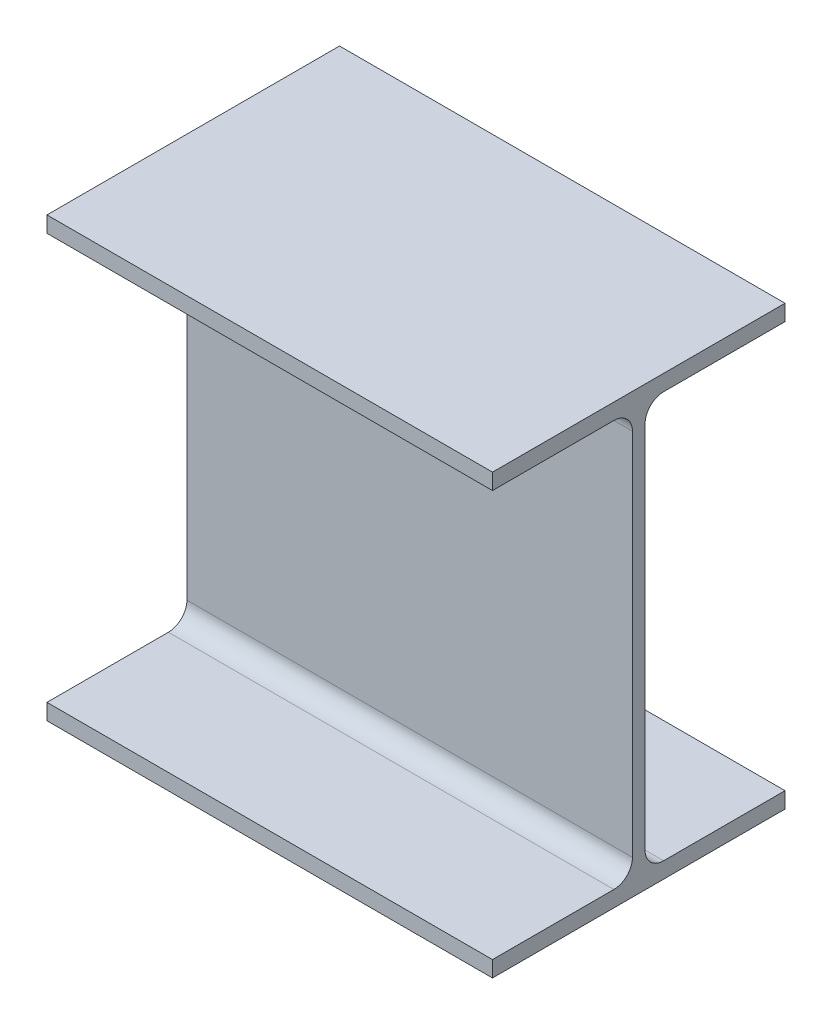
ISO-10303-21;
HEADER;
FILE_DESCRIPTION(('STEP AP214'),'2;1');
FILE_NAME('part.step','',(''),(''),'','','');
FILE_SCHEMA(('AUTOMOTIVE_DESIGN { 1 0 10303 214 1 1 1 1 }'));
ENDSEC;
DATA;
#1=APPLICATION_CONTEXT('core data for automotive mechanical design processes');
#2=APPLICATION_PROTOCOL_DEFINITION('international standard','automotive_design',2000,#1);
#3=PRODUCT_CONTEXT('',#1,'mechanical');
#4=PRODUCT('Part','Part','',(#3));
#5=PRODUCT_RELATED_PRODUCT_CATEGORY('part','',(#4));
#6=PRODUCT_DEFINITION_FORMATION('','',#4);
#7=PRODUCT_DEFINITION_CONTEXT('part definition',#1,'design');
#8=PRODUCT_DEFINITION('design','',#6,#7);
#9=PRODUCT_DEFINITION_SHAPE('','',#8);
#10=(LENGTH_UNIT() NAMED_UNIT(*) SI_UNIT(.MILLI.,.METRE.));
#11=(NAMED_UNIT(*) PLANE_ANGLE_UNIT() SI_UNIT($,.RADIAN.));
#12=(NAMED_UNIT(*) SI_UNIT($,.STERADIAN.) SOLID_ANGLE_UNIT());
#13=UNCERTAINTY_MEASURE_WITH_UNIT(LENGTH_MEASURE(1.E-05),#10,'distance_accuracy_value','');
#14=(GEOMETRIC_REPRESENTATION_CONTEXT(3) GLOBAL_UNCERTAINTY_ASSIGNED_CONTEXT((#13)) GLOBAL_UNIT_ASSIGNED_CONTEXT((#10,
#11,#12)) REPRESENTATION_CONTEXT('',''));
#15=CARTESIAN_POINT('',(0.,0.,0.));
#16=DIRECTION('',(0.,0.,1.));
#17=DIRECTION('',(1.,0.,0.));
#18=AXIS2_PLACEMENT_3D('',#15,#16,#17);
#19=CARTESIAN_POINT('',(152.4,-74.93,-50.038));
#20=DIRECTION('',(0.,1.,0.));
#21=DIRECTION('',(0.,0.,1.));
#22=AXIS2_PLACEMENT_3D('',#19,#20,#21);
#23=PLANE('',#22);
#24=DIRECTION('',(0.,0.,-1.));
#25=VECTOR('',#24,1.);
#26=CARTESIAN_POINT('',(0.,-74.93,-50.038));
#27=LINE('',#26,#25);
#28=CARTESIAN_POINT('',(0.,-74.93,50.038));
#29=VERTEX_POINT('',#28);
#30=CARTESIAN_POINT('',(0.,-74.93,-50.038));
#31=VERTEX_POINT('',#30);
#32=EDGE_CURVE('E11',#29,#31,#27,.T.);
#33=ORIENTED_EDGE('',*,*,#32,.T.);
#34=DIRECTION('',(-1.,0.,0.));
#35=VECTOR('',#34,1.);
#36=CARTESIAN_POINT('',(152.4,-74.93,-50.038));
#37=LINE('',#36,#35);
#38=CARTESIAN_POINT('',(152.4,-74.93,-50.038));
#39=VERTEX_POINT('',#38);
#40=EDGE_CURVE('E36',#39,#31,#37,.T.);
#41=ORIENTED_EDGE('',*,*,#40,.F.);
#42=DIRECTION('',(0.,0.,-1.));
#43=VECTOR('',#42,1.);
#44=CARTESIAN_POINT('',(152.4,-74.93,-50.038));
#45=LINE('',#44,#43);
#46=CARTESIAN_POINT('',(152.4,-74.93,50.038));
#47=VERTEX_POINT('',#46);
#48=EDGE_CURVE('E146',#47,#39,#45,.T.);
#49=ORIENTED_EDGE('',*,*,#48,.F.);
#50=DIRECTION('',(-1.,0.,0.));
#51=VECTOR('',#50,1.);
#52=CARTESIAN_POINT('',(152.4,-74.93,50.038));
#53=LINE('',#52,#51);
#54=EDGE_CURVE('E27',#47,#29,#53,.T.);
#55=ORIENTED_EDGE('',*,*,#54,.T.);
#56=EDGE_LOOP('',(#33,#41,#49,#55));
#57=FACE_BOUND('',#56,.T.);
#58=ADVANCED_FACE('F17',(#57),#23,.F.);
#59=CARTESIAN_POINT('',(152.4,-69.469,-50.038));
#60=DIRECTION('',(0.,0.,1.));
#61=DIRECTION('',(1.,0.,0.));
#62=AXIS2_PLACEMENT_3D('',#59,#60,#61);
#63=PLANE('',#62);
#64=DIRECTION('',(0.,1.,0.));
#65=VECTOR('',#64,1.);
#66=CARTESIAN_POINT('',(0.,-69.469,-50.038));
#67=LINE('',#66,#65);
#68=CARTESIAN_POINT('',(0.,-69.469,-50.038));
#69=VERTEX_POINT('',#68);
#70=EDGE_CURVE('E153',#31,#69,#67,.T.);
#71=ORIENTED_EDGE('',*,*,#70,.T.);
#72=DIRECTION('',(-1.,0.,0.));
#73=VECTOR('',#72,1.);
#74=CARTESIAN_POINT('',(152.4,-69.469,-50.038));
#75=LINE('',#74,#73);
#76=CARTESIAN_POINT('',(152.4,-69.469,-50.038));
#77=VERTEX_POINT('',#76);
#78=EDGE_CURVE('E159',#77,#69,#75,.T.);
#79=ORIENTED_EDGE('',*,*,#78,.F.);
#80=DIRECTION('',(0.,1.,0.));
#81=VECTOR('',#80,1.);
#82=CARTESIAN_POINT('',(152.4,-69.469,-50.038));
#83=LINE('',#82,#81);
#84=EDGE_CURVE('E163',#39,#77,#83,.T.);
#85=ORIENTED_EDGE('',*,*,#84,.F.);
#86=ORIENTED_EDGE('',*,*,#40,.T.);
#87=EDGE_LOOP('',(#71,#79,#85,#86));
#88=FACE_BOUND('',#87,.T.);
#89=ADVANCED_FACE('F255',(#88),#63,.F.);
#90=CARTESIAN_POINT('',(152.4,-69.469,-8.50900000000001));
#91=DIRECTION('',(0.,-1.,0.));
#92=DIRECTION('',(0.,0.,-1.));
#93=AXIS2_PLACEMENT_3D('',#90,#91,#92);
#94=PLANE('',#93);
#95=DIRECTION('',(0.,0.,1.));
#96=VECTOR('',#95,1.);
#97=CARTESIAN_POINT('',(0.,-69.469,-8.50900000000001));
#98=LINE('',#97,#96);
#99=CARTESIAN_POINT('',(0.,-69.469,-8.50900000000001));
#100=VERTEX_POINT('',#99);
#101=EDGE_CURVE('E161',#69,#100,#98,.T.);
#102=ORIENTED_EDGE('',*,*,#101,.T.);
#103=DIRECTION('',(-1.,0.,0.));
#104=VECTOR('',#103,1.);
#105=CARTESIAN_POINT('',(152.4,-69.469,-8.50900000000001));
#106=LINE('',#105,#104);
#107=CARTESIAN_POINT('',(152.4,-69.469,-8.50900000000001));
#108=VERTEX_POINT('',#107);
#109=EDGE_CURVE('E168',#108,#100,#106,.T.);
#110=ORIENTED_EDGE('',*,*,#109,.F.);
#111=DIRECTION('',(0.,0.,1.));
#112=VECTOR('',#111,1.);
#113=CARTESIAN_POINT('',(152.4,-69.469,-8.50900000000001));
#114=LINE('',#113,#112);
#115=EDGE_CURVE('E165',#77,#108,#114,.T.);
#116=ORIENTED_EDGE('',*,*,#115,.F.);
#117=ORIENTED_EDGE('',*,*,#78,.T.);
#118=EDGE_LOOP('',(#102,#110,#116,#117));
#119=FACE_BOUND('',#118,.T.);
#120=ADVANCED_FACE('F261',(#119),#94,.F.);
#121=CARTESIAN_POINT('',(152.4,-63.119,-8.50900000000001));
#122=DIRECTION('',(-1.,0.,0.));
#123=DIRECTION('',(0.,0.,1.));
#124=AXIS2_PLACEMENT_3D('',#121,#122,#123);
#125=CYLINDRICAL_SURFACE('',#124,6.35);
#126=CARTESIAN_POINT('',(0.,-63.119,-8.50900000000001));
#127=DIRECTION('',(-1.,0.,0.));
#128=DIRECTION('',(0.,0.,-1.));
#129=AXIS2_PLACEMENT_3D('',#126,#127,#128);
#130=CIRCLE('',#129,6.35);
#131=CARTESIAN_POINT('',(0.,-63.119,-2.15900000000001));
#132=VERTEX_POINT('',#131);
#133=EDGE_CURVE('E162',#100,#132,#130,.T.);
#134=ORIENTED_EDGE('',*,*,#133,.T.);
#135=DIRECTION('',(-1.,0.,0.));
#136=VECTOR('',#135,1.);
#137=CARTESIAN_POINT('',(152.4,-63.119,-2.15900000000001));
#138=LINE('',#137,#136);
#139=CARTESIAN_POINT('',(152.4,-63.119,-2.15900000000001));
#140=VERTEX_POINT('',#139);
#141=EDGE_CURVE('E175',#140,#132,#138,.T.);
#142=ORIENTED_EDGE('',*,*,#141,.F.);
#143=CARTESIAN_POINT('',(152.4,-63.119,-8.50900000000001));
#144=DIRECTION('',(-1.,0.,0.));
#145=DIRECTION('',(0.,0.,-1.));
#146=AXIS2_PLACEMENT_3D('',#143,#144,#145);
#147=CIRCLE('',#146,6.35);
#148=EDGE_CURVE('E172',#108,#140,#147,.T.);
#149=ORIENTED_EDGE('',*,*,#148,.F.);
#150=ORIENTED_EDGE('',*,*,#109,.T.);
#151=EDGE_LOOP('',(#134,#142,#149,#150));
#152=FACE_BOUND('',#151,.T.);
#153=ADVANCED_FACE('F264',(#152),#125,.F.);
#154=CARTESIAN_POINT('',(152.4,63.119,-2.15900000000001));
#155=DIRECTION('',(0.,0.,1.));
#156=DIRECTION('',(1.,0.,0.));
#157=AXIS2_PLACEMENT_3D('',#154,#155,#156);
#158=PLANE('',#157);
#159=DIRECTION('',(0.,1.,0.));
#160=VECTOR('',#159,1.);
#161=CARTESIAN_POINT('',(0.,63.119,-2.15900000000001));
#162=LINE('',#161,#160);
#163=CARTESIAN_POINT('',(0.,63.119,-2.15900000000001));
#164=VERTEX_POINT('',#163);
#165=EDGE_CURVE('E170',#132,#164,#162,.T.);
#166=ORIENTED_EDGE('',*,*,#165,.T.);
#167=DIRECTION('',(-1.,0.,0.));
#168=VECTOR('',#167,1.);
#169=CARTESIAN_POINT('',(152.4,63.119,-2.15900000000001));
#170=LINE('',#169,#168);
#171=CARTESIAN_POINT('',(152.4,63.119,-2.15900000000001));
#172=VERTEX_POINT('',#171);
#173=EDGE_CURVE('E182',#172,#164,#170,.T.);
#174=ORIENTED_EDGE('',*,*,#173,.F.);
#175=DIRECTION('',(0.,1.,0.));
#176=VECTOR('',#175,1.);
#177=CARTESIAN_POINT('',(152.4,63.119,-2.15900000000001));
#178=LINE('',#177,#176);
#179=EDGE_CURVE('E179',#140,#172,#178,.T.);
#180=ORIENTED_EDGE('',*,*,#179,.F.);
#181=ORIENTED_EDGE('',*,*,#141,.T.);
#182=EDGE_LOOP('',(#166,#174,#180,#181));
#183=FACE_BOUND('',#182,.T.);
#184=ADVANCED_FACE('F269',(#183),#158,.F.);
#185=CARTESIAN_POINT('',(152.4,63.119,-8.50900000000001));
#186=DIRECTION('',(-1.,0.,0.));
#187=DIRECTION('',(0.,0.,1.));
#188=AXIS2_PLACEMENT_3D('',#185,#186,#187);
#189=CYLINDRICAL_SURFACE('',#188,6.35);
#190=CARTESIAN_POINT('',(0.,63.119,-8.50900000000001));
#191=DIRECTION('',(-1.,0.,0.));
#192=DIRECTION('',(0.,0.,-1.));
#193=AXIS2_PLACEMENT_3D('',#190,#191,#192);
#194=CIRCLE('',#193,6.35);
#195=CARTESIAN_POINT('',(0.,69.469,-8.50900000000001));
#196=VERTEX_POINT('',#195);
#197=EDGE_CURVE('E177',#164,#196,#194,.T.);
#198=ORIENTED_EDGE('',*,*,#197,.T.);
#199=DIRECTION('',(-1.,0.,0.));
#200=VECTOR('',#199,1.);
#201=CARTESIAN_POINT('',(152.4,69.469,-8.50900000000001));
#202=LINE('',#201,#200);
#203=CARTESIAN_POINT('',(152.4,69.469,-8.50900000000001));
#204=VERTEX_POINT('',#203);
#205=EDGE_CURVE('E189',#204,#196,#202,.T.);
#206=ORIENTED_EDGE('',*,*,#205,.F.);
#207=CARTESIAN_POINT('',(152.4,63.119,-8.50900000000001));
#208=DIRECTION('',(-1.,0.,0.));
#209=DIRECTION('',(0.,0.,-1.));
#210=AXIS2_PLACEMENT_3D('',#207,#208,#209);
#211=CIRCLE('',#210,6.35);
#212=EDGE_CURVE('E186',#172,#204,#211,.T.);
#213=ORIENTED_EDGE('',*,*,#212,.F.);
#214=ORIENTED_EDGE('',*,*,#173,.T.);
#215=EDGE_LOOP('',(#198,#206,#213,#214));
#216=FACE_BOUND('',#215,.T.);
#217=ADVANCED_FACE('F275',(#216),#189,.F.);
#218=CARTESIAN_POINT('',(152.4,69.469,-50.038));
#219=DIRECTION('',(0.,1.,0.));
#220=DIRECTION('',(0.,0.,1.));
#221=AXIS2_PLACEMENT_3D('',#218,#219,#220);
#222=PLANE('',#221);
#223=DIRECTION('',(0.,0.,-1.));
#224=VECTOR('',#223,1.);
#225=CARTESIAN_POINT('',(0.,69.469,-50.038));
#226=LINE('',#225,#224);
#227=CARTESIAN_POINT('',(0.,69.469,-50.038));
#228=VERTEX_POINT('',#227);
#229=EDGE_CURVE('E184',#196,#228,#226,.T.);
#230=ORIENTED_EDGE('',*,*,#229,.T.);
#231=DIRECTION('',(-1.,0.,0.));
#232=VECTOR('',#231,1.);
#233=CARTESIAN_POINT('',(152.4,69.469,-50.038));
#234=LINE('',#233,#232);
#235=CARTESIAN_POINT('',(152.4,69.469,-50.038));
#236=VERTEX_POINT('',#235);
#237=EDGE_CURVE('E196',#236,#228,#234,.T.);
#238=ORIENTED_EDGE('',*,*,#237,.F.);
#239=DIRECTION('',(0.,0.,-1.));
#240=VECTOR('',#239,1.);
#241=CARTESIAN_POINT('',(152.4,69.469,-50.038));
#242=LINE('',#241,#240);
#243=EDGE_CURVE('E193',#204,#236,#242,.T.);
#244=ORIENTED_EDGE('',*,*,#243,.F.);
#245=ORIENTED_EDGE('',*,*,#205,.T.);
#246=EDGE_LOOP('',(#230,#238,#244,#245));
#247=FACE_BOUND('',#246,.T.);
#248=ADVANCED_FACE('F279',(#247),#222,.F.);
#249=CARTESIAN_POINT('',(152.4,74.93,-50.038));
#250=DIRECTION('',(0.,0.,1.));
#251=DIRECTION('',(0.,-1.,0.));
#252=AXIS2_PLACEMENT_3D('',#249,#250,#251);
#253=PLANE('',#252);
#254=DIRECTION('',(0.,1.,0.));
#255=VECTOR('',#254,1.);
#256=CARTESIAN_POINT('',(0.,74.93,-50.038));
#257=LINE('',#256,#255);
#258=CARTESIAN_POINT('',(0.,74.93,-50.038));
#259=VERTEX_POINT('',#258);
#260=EDGE_CURVE('E191',#228,#259,#257,.T.);
#261=ORIENTED_EDGE('',*,*,#260,.T.);
#262=DIRECTION('',(-1.,0.,0.));
#263=VECTOR('',#262,1.);
#264=CARTESIAN_POINT('',(152.4,74.93,-50.038));
#265=LINE('',#264,#263);
#266=CARTESIAN_POINT('',(152.4,74.93,-50.038));
#267=VERTEX_POINT('',#266);
#268=EDGE_CURVE('E203',#267,#259,#265,.T.);
#269=ORIENTED_EDGE('',*,*,#268,.F.);
#270=DIRECTION('',(0.,1.,0.));
#271=VECTOR('',#270,1.);
#272=CARTESIAN_POINT('',(152.4,74.93,-50.038));
#273=LINE('',#272,#271);
#274=EDGE_CURVE('E200',#236,#267,#273,.T.);
#275=ORIENTED_EDGE('',*,*,#274,.F.);
#276=ORIENTED_EDGE('',*,*,#237,.T.);
#277=EDGE_LOOP('',(#261,#269,#275,#276));
#278=FACE_BOUND('',#277,.T.);
#279=ADVANCED_FACE('F284',(#278),#253,.F.);
#280=CARTESIAN_POINT('',(152.4,74.93,50.038));
#281=DIRECTION('',(0.,-1.,0.));
#282=DIRECTION('',(0.,0.,-1.));
#283=AXIS2_PLACEMENT_3D('',#280,#281,#282);
#284=PLANE('',#283);
#285=DIRECTION('',(0.,0.,1.));
#286=VECTOR('',#285,1.);
#287=CARTESIAN_POINT('',(0.,74.93,50.038));
#288=LINE('',#287,#286);
#289=CARTESIAN_POINT('',(0.,74.93,50.038));
#290=VERTEX_POINT('',#289);
#291=EDGE_CURVE('E198',#259,#290,#288,.T.);
#292=ORIENTED_EDGE('',*,*,#291,.T.);
#293=DIRECTION('',(-1.,0.,0.));
#294=VECTOR('',#293,1.);
#295=CARTESIAN_POINT('',(152.4,74.93,50.038));
#296=LINE('',#295,#294);
#297=CARTESIAN_POINT('',(152.4,74.93,50.038));
#298=VERTEX_POINT('',#297);
#299=EDGE_CURVE('E210',#298,#290,#296,.T.);
#300=ORIENTED_EDGE('',*,*,#299,.F.);
#301=DIRECTION('',(0.,0.,1.));
#302=VECTOR('',#301,1.);
#303=CARTESIAN_POINT('',(152.4,74.93,50.038));
#304=LINE('',#303,#302);
#305=EDGE_CURVE('E207',#267,#298,#304,.T.);
#306=ORIENTED_EDGE('',*,*,#305,.F.);
#307=ORIENTED_EDGE('',*,*,#268,.T.);
#308=EDGE_LOOP('',(#292,#300,#306,#307));
#309=FACE_BOUND('',#308,.T.);
#310=ADVANCED_FACE('F290',(#309),#284,.F.);
#311=CARTESIAN_POINT('',(152.4,69.469,50.038));
#312=DIRECTION('',(0.,0.,-1.));
#313=DIRECTION('',(0.,1.,0.));
#314=AXIS2_PLACEMENT_3D('',#311,#312,#313);
#315=PLANE('',#314);
#316=DIRECTION('',(0.,-1.,0.));
#317=VECTOR('',#316,1.);
#318=CARTESIAN_POINT('',(0.,69.469,50.038));
#319=LINE('',#318,#317);
#320=CARTESIAN_POINT('',(0.,69.469,50.038));
#321=VERTEX_POINT('',#320);
#322=EDGE_CURVE('E205',#290,#321,#319,.T.);
#323=ORIENTED_EDGE('',*,*,#322,.T.);
#324=DIRECTION('',(-1.,0.,0.));
#325=VECTOR('',#324,1.);
#326=CARTESIAN_POINT('',(152.4,69.469,50.038));
#327=LINE('',#326,#325);
#328=CARTESIAN_POINT('',(152.4,69.469,50.038));
#329=VERTEX_POINT('',#328);
#330=EDGE_CURVE('E217',#329,#321,#327,.T.);
#331=ORIENTED_EDGE('',*,*,#330,.F.);
#332=DIRECTION('',(0.,-1.,0.));
#333=VECTOR('',#332,1.);
#334=CARTESIAN_POINT('',(152.4,69.469,50.038));
#335=LINE('',#334,#333);
#336=EDGE_CURVE('E214',#298,#329,#335,.T.);
#337=ORIENTED_EDGE('',*,*,#336,.F.);
#338=ORIENTED_EDGE('',*,*,#299,.T.);
#339=EDGE_LOOP('',(#323,#331,#337,#338));
#340=FACE_BOUND('',#339,.T.);
#341=ADVANCED_FACE('F294',(#340),#315,.F.);
#342=CARTESIAN_POINT('',(152.4,69.469,8.50899999999998));
#343=DIRECTION('',(0.,1.,0.));
#344=DIRECTION('',(0.,0.,1.));
#345=AXIS2_PLACEMENT_3D('',#342,#343,#344);
#346=PLANE('',#345);
#347=DIRECTION('',(0.,0.,-1.));
#348=VECTOR('',#347,1.);
#349=CARTESIAN_POINT('',(0.,69.469,8.50899999999998));
#350=LINE('',#349,#348);
#351=CARTESIAN_POINT('',(0.,69.469,8.50899999999998));
#352=VERTEX_POINT('',#351);
#353=EDGE_CURVE('E212',#321,#352,#350,.T.);
#354=ORIENTED_EDGE('',*,*,#353,.T.);
#355=DIRECTION('',(-1.,0.,0.));
#356=VECTOR('',#355,1.);
#357=CARTESIAN_POINT('',(152.4,69.469,8.50899999999998));
#358=LINE('',#357,#356);
#359=CARTESIAN_POINT('',(152.4,69.469,8.50899999999998));
#360=VERTEX_POINT('',#359);
#361=EDGE_CURVE('E224',#360,#352,#358,.T.);
#362=ORIENTED_EDGE('',*,*,#361,.F.);
#363=DIRECTION('',(0.,0.,-1.));
#364=VECTOR('',#363,1.);
#365=CARTESIAN_POINT('',(152.4,69.469,8.50899999999998));
#366=LINE('',#365,#364);
#367=EDGE_CURVE('E221',#329,#360,#366,.T.);
#368=ORIENTED_EDGE('',*,*,#367,.F.);
#369=ORIENTED_EDGE('',*,*,#330,.T.);
#370=EDGE_LOOP('',(#354,#362,#368,#369));
#371=FACE_BOUND('',#370,.T.);
#372=ADVANCED_FACE('F299',(#371),#346,.F.);
#373=CARTESIAN_POINT('',(152.4,63.119,8.50899999999998));
#374=DIRECTION('',(-1.,0.,0.));
#375=DIRECTION('',(0.,0.,1.));
#376=AXIS2_PLACEMENT_3D('',#373,#374,#375);
#377=CYLINDRICAL_SURFACE('',#376,6.35);
#378=CARTESIAN_POINT('',(0.,63.119,8.50899999999998));
#379=DIRECTION('',(-1.,0.,0.));
#380=DIRECTION('',(0.,0.,-1.));
#381=AXIS2_PLACEMENT_3D('',#378,#379,#380);
#382=CIRCLE('',#381,6.35);
#383=CARTESIAN_POINT('',(0.,63.119,2.15899999999998));
#384=VERTEX_POINT('',#383);
#385=EDGE_CURVE('E219',#352,#384,#382,.T.);
#386=ORIENTED_EDGE('',*,*,#385,.T.);
#387=DIRECTION('',(-1.,0.,0.));
#388=VECTOR('',#387,1.);
#389=CARTESIAN_POINT('',(152.4,63.119,2.15899999999998));
#390=LINE('',#389,#388);
#391=CARTESIAN_POINT('',(152.4,63.119,2.15899999999998));
#392=VERTEX_POINT('',#391);
#393=EDGE_CURVE('E231',#392,#384,#390,.T.);
#394=ORIENTED_EDGE('',*,*,#393,.F.);
#395=CARTESIAN_POINT('',(152.4,63.119,8.50899999999998));
#396=DIRECTION('',(-1.,0.,0.));
#397=DIRECTION('',(0.,0.,-1.));
#398=AXIS2_PLACEMENT_3D('',#395,#396,#397);
#399=CIRCLE('',#398,6.35);
#400=EDGE_CURVE('E228',#360,#392,#399,.T.);
#401=ORIENTED_EDGE('',*,*,#400,.F.);
#402=ORIENTED_EDGE('',*,*,#361,.T.);
#403=EDGE_LOOP('',(#386,#394,#401,#402));
#404=FACE_BOUND('',#403,.T.);
#405=ADVANCED_FACE('F304',(#404),#377,.F.);
#406=CARTESIAN_POINT('',(152.4,-63.119,2.15899999999998));
#407=DIRECTION('',(0.,0.,-1.));
#408=DIRECTION('',(-1.,0.,0.));
#409=AXIS2_PLACEMENT_3D('',#406,#407,#408);
#410=PLANE('',#409);
#411=DIRECTION('',(0.,-1.,0.));
#412=VECTOR('',#411,1.);
#413=CARTESIAN_POINT('',(0.,-63.119,2.15899999999998));
#414=LINE('',#413,#412);
#415=CARTESIAN_POINT('',(0.,-63.119,2.15899999999998));
#416=VERTEX_POINT('',#415);
#417=EDGE_CURVE('E226',#384,#416,#414,.T.);
#418=ORIENTED_EDGE('',*,*,#417,.T.);
#419=DIRECTION('',(-1.,0.,0.));
#420=VECTOR('',#419,1.);
#421=CARTESIAN_POINT('',(152.4,-63.119,2.15899999999998));
#422=LINE('',#421,#420);
#423=CARTESIAN_POINT('',(152.4,-63.119,2.15899999999998));
#424=VERTEX_POINT('',#423);
#425=EDGE_CURVE('E238',#424,#416,#422,.T.);
#426=ORIENTED_EDGE('',*,*,#425,.F.);
#427=DIRECTION('',(0.,-1.,0.));
#428=VECTOR('',#427,1.);
#429=CARTESIAN_POINT('',(152.4,-63.119,2.15899999999998));
#430=LINE('',#429,#428);
#431=EDGE_CURVE('E235',#392,#424,#430,.T.);
#432=ORIENTED_EDGE('',*,*,#431,.F.);
#433=ORIENTED_EDGE('',*,*,#393,.T.);
#434=EDGE_LOOP('',(#418,#426,#432,#433));
#435=FACE_BOUND('',#434,.T.);
#436=ADVANCED_FACE('F307',(#435),#410,.F.);
#437=CARTESIAN_POINT('',(152.4,-63.119,8.50899999999998));
#438=DIRECTION('',(-1.,0.,0.));
#439=DIRECTION('',(0.,0.,1.));
#440=AXIS2_PLACEMENT_3D('',#437,#438,#439);
#441=CYLINDRICAL_SURFACE('',#440,6.35);
#442=CARTESIAN_POINT('',(0.,-63.119,8.50899999999998));
#443=DIRECTION('',(-1.,0.,0.));
#444=DIRECTION('',(0.,0.,-1.));
#445=AXIS2_PLACEMENT_3D('',#442,#443,#444);
#446=CIRCLE('',#445,6.35);
#447=CARTESIAN_POINT('',(0.,-69.469,8.50899999999998));
#448=VERTEX_POINT('',#447);
#449=EDGE_CURVE('E233',#416,#448,#446,.T.);
#450=ORIENTED_EDGE('',*,*,#449,.T.);
#451=DIRECTION('',(-1.,0.,0.));
#452=VECTOR('',#451,1.);
#453=CARTESIAN_POINT('',(152.4,-69.469,8.50899999999998));
#454=LINE('',#453,#452);
#455=CARTESIAN_POINT('',(152.4,-69.469,8.50899999999998));
#456=VERTEX_POINT('',#455);
#457=EDGE_CURVE('E243',#456,#448,#454,.T.);
#458=ORIENTED_EDGE('',*,*,#457,.F.);
#459=CARTESIAN_POINT('',(152.4,-63.119,8.50899999999998));
#460=DIRECTION('',(-1.,0.,0.));
#461=DIRECTION('',(0.,0.,-1.));
#462=AXIS2_PLACEMENT_3D('',#459,#460,#461);
#463=CIRCLE('',#462,6.35);
#464=EDGE_CURVE('E137',#424,#456,#463,.T.);
#465=ORIENTED_EDGE('',*,*,#464,.F.);
#466=ORIENTED_EDGE('',*,*,#425,.T.);
#467=EDGE_LOOP('',(#450,#458,#465,#466));
#468=FACE_BOUND('',#467,.T.);
#469=ADVANCED_FACE('F248',(#468),#441,.F.);
#470=CARTESIAN_POINT('',(152.4,-69.469,50.038));
#471=DIRECTION('',(0.,-1.,0.));
#472=DIRECTION('',(0.,0.,-1.));
#473=AXIS2_PLACEMENT_3D('',#470,#471,#472);
#474=PLANE('',#473);
#475=DIRECTION('',(0.,0.,1.));
#476=VECTOR('',#475,1.);
#477=CARTESIAN_POINT('',(0.,-69.469,50.038));
#478=LINE('',#477,#476);
#479=CARTESIAN_POINT('',(0.,-69.469,50.038));
#480=VERTEX_POINT('',#479);
#481=EDGE_CURVE('E143',#448,#480,#478,.T.);
#482=ORIENTED_EDGE('',*,*,#481,.T.);
#483=DIRECTION('',(-1.,0.,0.));
#484=VECTOR('',#483,1.);
#485=CARTESIAN_POINT('',(152.4,-69.469,50.038));
#486=LINE('',#485,#484);
#487=CARTESIAN_POINT('',(152.4,-69.469,50.038));
#488=VERTEX_POINT('',#487);
#489=EDGE_CURVE('E128',#488,#480,#486,.T.);
#490=ORIENTED_EDGE('',*,*,#489,.F.);
#491=DIRECTION('',(0.,0.,1.));
#492=VECTOR('',#491,1.);
#493=CARTESIAN_POINT('',(152.4,-69.469,50.038));
#494=LINE('',#493,#492);
#495=EDGE_CURVE('E134',#456,#488,#494,.T.);
#496=ORIENTED_EDGE('',*,*,#495,.F.);
#497=ORIENTED_EDGE('',*,*,#457,.T.);
#498=EDGE_LOOP('',(#482,#490,#496,#497));
#499=FACE_BOUND('',#498,.T.);
#500=ADVANCED_FACE('F141',(#499),#474,.F.);
#501=CARTESIAN_POINT('',(152.4,-74.93,50.038));
#502=DIRECTION('',(0.,0.,-1.));
#503=DIRECTION('',(-1.,0.,0.));
#504=AXIS2_PLACEMENT_3D('',#501,#502,#503);
#505=PLANE('',#504);
#506=DIRECTION('',(0.,-1.,0.));
#507=VECTOR('',#506,1.);
#508=CARTESIAN_POINT('',(0.,-74.93,50.038));
#509=LINE('',#508,#507);
#510=EDGE_CURVE('E145',#480,#29,#509,.T.);
#511=ORIENTED_EDGE('',*,*,#510,.T.);
#512=ORIENTED_EDGE('',*,*,#54,.F.);
#513=DIRECTION('',(0.,-1.,0.));
#514=VECTOR('',#513,1.);
#515=CARTESIAN_POINT('',(152.4,-74.93,50.038));
#516=LINE('',#515,#514);
#517=EDGE_CURVE('E21',#488,#47,#516,.T.);
#518=ORIENTED_EDGE('',*,*,#517,.F.);
#519=ORIENTED_EDGE('',*,*,#489,.T.);
#520=EDGE_LOOP('',(#511,#512,#518,#519));
#521=FACE_BOUND('',#520,.T.);
#522=ADVANCED_FACE('F149',(#521),#505,.F.);
#523=CARTESIAN_POINT('',(152.4,-63.119,8.50899999999998));
#524=DIRECTION('',(1.,0.,0.));
#525=DIRECTION('',(0.,0.,-1.));
#526=AXIS2_PLACEMENT_3D('',#523,#524,#525);
#527=PLANE('',#526);
#528=ORIENTED_EDGE('',*,*,#48,.T.);
#529=ORIENTED_EDGE('',*,*,#84,.T.);
#530=ORIENTED_EDGE('',*,*,#115,.T.);
#531=ORIENTED_EDGE('',*,*,#148,.T.);
#532=ORIENTED_EDGE('',*,*,#179,.T.);
#533=ORIENTED_EDGE('',*,*,#212,.T.);
#534=ORIENTED_EDGE('',*,*,#243,.T.);
#535=ORIENTED_EDGE('',*,*,#274,.T.);
#536=ORIENTED_EDGE('',*,*,#305,.T.);
#537=ORIENTED_EDGE('',*,*,#336,.T.);
#538=ORIENTED_EDGE('',*,*,#367,.T.);
#539=ORIENTED_EDGE('',*,*,#400,.T.);
#540=ORIENTED_EDGE('',*,*,#431,.T.);
#541=ORIENTED_EDGE('',*,*,#464,.T.);
#542=ORIENTED_EDGE('',*,*,#495,.T.);
#543=ORIENTED_EDGE('',*,*,#517,.T.);
#544=EDGE_LOOP('',(#528,#529,#530,#531,#532,#533,#534,#535,#536,#537,#538,#539,#540,#541,#542,#543));
#545=FACE_BOUND('',#544,.T.);
#546=ADVANCED_FACE('F135',(#545),#527,.T.);
#547=CARTESIAN_POINT('',(0.,-63.119,8.50899999999998));
#548=DIRECTION('',(1.,0.,0.));
#549=DIRECTION('',(0.,0.,-1.));
#550=AXIS2_PLACEMENT_3D('',#547,#548,#549);
#551=PLANE('',#550);
#552=ORIENTED_EDGE('',*,*,#32,.F.);
#553=ORIENTED_EDGE('',*,*,#510,.F.);
#554=ORIENTED_EDGE('',*,*,#481,.F.);
#555=ORIENTED_EDGE('',*,*,#449,.F.);
#556=ORIENTED_EDGE('',*,*,#417,.F.);
#557=ORIENTED_EDGE('',*,*,#385,.F.);
#558=ORIENTED_EDGE('',*,*,#353,.F.);
#559=ORIENTED_EDGE('',*,*,#322,.F.);
#560=ORIENTED_EDGE('',*,*,#291,.F.);
#561=ORIENTED_EDGE('',*,*,#260,.F.);
#562=ORIENTED_EDGE('',*,*,#229,.F.);
#563=ORIENTED_EDGE('',*,*,#197,.F.);
#564=ORIENTED_EDGE('',*,*,#165,.F.);
#565=ORIENTED_EDGE('',*,*,#133,.F.);
#566=ORIENTED_EDGE('',*,*,#101,.F.);
#567=ORIENTED_EDGE('',*,*,#70,.F.);
#568=EDGE_LOOP('',(#552,#553,#554,#555,#556,#557,#558,#559,#560,#561,#562,#563,#564,#565,#566,#567));
#569=FACE_BOUND('',#568,.T.);
#570=ADVANCED_FACE('F19',(#569),#551,.F.);
#571=CLOSED_SHELL('',(#58,#89,#120,#153,#184,#217,#248,#279,#310,#341,#372,#405,#436,#469,#500,
#522,#546,#570));
#572=MANIFOLD_SOLID_BREP('B1',#571);
#573=ADVANCED_BREP_SHAPE_REPRESENTATION('',(#18,#572),#14);
#574=SHAPE_DEFINITION_REPRESENTATION(#9,#573);
ENDSEC;
END-ISO-10303-21;
